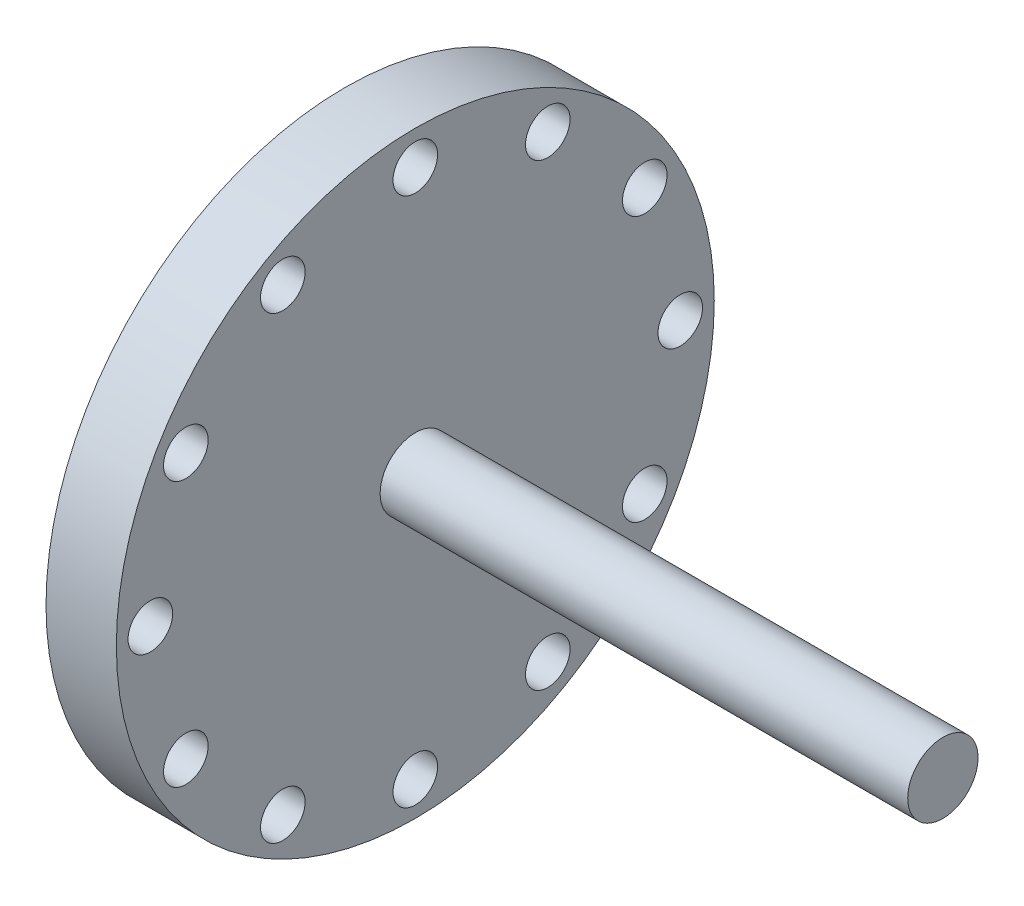
ISO-10303-21;
HEADER;
FILE_DESCRIPTION(('STEP AP214'),'2;1');
FILE_NAME('part.step','',(''),(''),'','','');
FILE_SCHEMA(('AUTOMOTIVE_DESIGN { 1 0 10303 214 1 1 1 1 }'));
ENDSEC;
DATA;
#1=APPLICATION_CONTEXT('core data for automotive mechanical design processes');
#2=APPLICATION_PROTOCOL_DEFINITION('international standard','automotive_design',2000,#1);
#3=PRODUCT_CONTEXT('',#1,'mechanical');
#4=PRODUCT('Part','Part','',(#3));
#5=PRODUCT_RELATED_PRODUCT_CATEGORY('part','',(#4));
#6=PRODUCT_DEFINITION_FORMATION('','',#4);
#7=PRODUCT_DEFINITION_CONTEXT('part definition',#1,'design');
#8=PRODUCT_DEFINITION('design','',#6,#7);
#9=PRODUCT_DEFINITION_SHAPE('','',#8);
#10=(LENGTH_UNIT() NAMED_UNIT(*) SI_UNIT(.MILLI.,.METRE.));
#11=(NAMED_UNIT(*) PLANE_ANGLE_UNIT() SI_UNIT($,.RADIAN.));
#12=(NAMED_UNIT(*) SI_UNIT($,.STERADIAN.) SOLID_ANGLE_UNIT());
#13=UNCERTAINTY_MEASURE_WITH_UNIT(LENGTH_MEASURE(1.E-05),#10,'distance_accuracy_value','');
#14=(GEOMETRIC_REPRESENTATION_CONTEXT(3) GLOBAL_UNCERTAINTY_ASSIGNED_CONTEXT((#13)) GLOBAL_UNIT_ASSIGNED_CONTEXT((#10,
#11,#12)) REPRESENTATION_CONTEXT('',''));
#15=CARTESIAN_POINT('',(0.,0.,0.));
#16=DIRECTION('',(0.,0.,1.));
#17=DIRECTION('',(1.,0.,0.));
#18=AXIS2_PLACEMENT_3D('',#15,#16,#17);
#19=CARTESIAN_POINT('',(0.,0.,0.));
#20=DIRECTION('',(1.,0.,0.));
#21=DIRECTION('',(0.,0.,-1.));
#22=AXIS2_PLACEMENT_3D('',#19,#20,#21);
#23=PLANE('',#22);
#24=CARTESIAN_POINT('',(0.,0.,0.));
#25=DIRECTION('',(-1.,0.,0.));
#26=DIRECTION('',(0.,0.,1.));
#27=AXIS2_PLACEMENT_3D('',#24,#25,#26);
#28=CIRCLE('',#27,20.);
#29=CARTESIAN_POINT('',(0.,0.,20.));
#30=VERTEX_POINT('',#29);
#31=EDGE_CURVE('E10',#30,#30,#28,.T.);
#32=ORIENTED_EDGE('',*,*,#31,.T.);
#33=EDGE_LOOP('',(#32));
#34=FACE_BOUND('',#33,.T.);
#35=ADVANCED_FACE('F37',(#34),#23,.F.);
#36=CARTESIAN_POINT('',(0.,0.,0.));
#37=DIRECTION('',(-1.,0.,0.));
#38=DIRECTION('',(0.,0.,1.));
#39=AXIS2_PLACEMENT_3D('',#36,#37,#38);
#40=CYLINDRICAL_SURFACE('',#39,20.);
#41=ORIENTED_EDGE('',*,*,#31,.F.);
#42=EDGE_LOOP('',(#41));
#43=FACE_BOUND('',#42,.T.);
#44=CARTESIAN_POINT('',(10.,0.,0.));
#45=DIRECTION('',(-1.,0.,0.));
#46=DIRECTION('',(0.,0.,1.));
#47=AXIS2_PLACEMENT_3D('',#44,#45,#46);
#48=CIRCLE('',#47,20.);
#49=CARTESIAN_POINT('',(10.,0.,20.));
#50=VERTEX_POINT('',#49);
#51=EDGE_CURVE('E44',#50,#50,#48,.T.);
#52=ORIENTED_EDGE('',*,*,#51,.T.);
#53=EDGE_LOOP('',(#52));
#54=FACE_BOUND('',#53,.T.);
#55=ADVANCED_FACE('F169',(#43,#54),#40,.T.);
#56=CARTESIAN_POINT('',(10.,20.,0.));
#57=DIRECTION('',(1.,0.,0.));
#58=DIRECTION('',(0.,0.,-1.));
#59=AXIS2_PLACEMENT_3D('',#56,#57,#58);
#60=PLANE('',#59);
#61=CARTESIAN_POINT('',(10.,97.8608706276416,-56.5));
#62=DIRECTION('',(1.,0.,0.));
#63=DIRECTION('',(0.,0.,-1.));
#64=AXIS2_PLACEMENT_3D('',#61,#62,#63);
#65=CIRCLE('',#64,9.50000000000001);
#66=CARTESIAN_POINT('',(10.,97.8608706276416,-66.));
#67=VERTEX_POINT('',#66);
#68=EDGE_CURVE('E95',#67,#67,#65,.F.);
#69=ORIENTED_EDGE('',*,*,#68,.F.);
#70=EDGE_LOOP('',(#69));
#71=FACE_BOUND('',#70,.T.);
#72=CARTESIAN_POINT('',(10.,56.4999999999999,-97.8608706276416));
#73=DIRECTION('',(1.,0.,0.));
#74=DIRECTION('',(0.,0.,-1.));
#75=AXIS2_PLACEMENT_3D('',#72,#73,#74);
#76=CIRCLE('',#75,9.5);
#77=CARTESIAN_POINT('',(10.,56.4999999999999,-107.360870627642));
#78=VERTEX_POINT('',#77);
#79=EDGE_CURVE('E92',#78,#78,#76,.F.);
#80=ORIENTED_EDGE('',*,*,#79,.F.);
#81=EDGE_LOOP('',(#80));
#82=FACE_BOUND('',#81,.T.);
#83=CARTESIAN_POINT('',(10.,0.,-113.));
#84=DIRECTION('',(1.,0.,0.));
#85=DIRECTION('',(0.,0.,-1.));
#86=AXIS2_PLACEMENT_3D('',#83,#84,#85);
#87=CIRCLE('',#86,9.49999999999999);
#88=CARTESIAN_POINT('',(10.,0.,-122.5));
#89=VERTEX_POINT('',#88);
#90=EDGE_CURVE('E89',#89,#89,#87,.F.);
#91=ORIENTED_EDGE('',*,*,#90,.F.);
#92=EDGE_LOOP('',(#91));
#93=FACE_BOUND('',#92,.T.);
#94=CARTESIAN_POINT('',(10.,-56.5,-97.8608706276415));
#95=DIRECTION('',(1.,0.,0.));
#96=DIRECTION('',(0.,0.,-1.));
#97=AXIS2_PLACEMENT_3D('',#94,#95,#96);
#98=CIRCLE('',#97,9.5);
#99=CARTESIAN_POINT('',(10.,-56.5,-107.360870627642));
#100=VERTEX_POINT('',#99);
#101=EDGE_CURVE('E85',#100,#100,#98,.F.);
#102=ORIENTED_EDGE('',*,*,#101,.F.);
#103=EDGE_LOOP('',(#102));
#104=FACE_BOUND('',#103,.T.);
#105=CARTESIAN_POINT('',(10.,-97.8608706276416,-56.5));
#106=DIRECTION('',(1.,0.,0.));
#107=DIRECTION('',(0.,0.,-1.));
#108=AXIS2_PLACEMENT_3D('',#105,#106,#107);
#109=CIRCLE('',#108,9.50000000000001);
#110=CARTESIAN_POINT('',(10.,-97.8608706276416,-66.));
#111=VERTEX_POINT('',#110);
#112=EDGE_CURVE('E81',#111,#111,#109,.F.);
#113=ORIENTED_EDGE('',*,*,#112,.F.);
#114=EDGE_LOOP('',(#113));
#115=FACE_BOUND('',#114,.T.);
#116=CARTESIAN_POINT('',(10.,-113.,0.));
#117=DIRECTION('',(1.,0.,0.));
#118=DIRECTION('',(0.,0.,-1.));
#119=AXIS2_PLACEMENT_3D('',#116,#117,#118);
#120=CIRCLE('',#119,9.49999999999998);
#121=CARTESIAN_POINT('',(10.,-113.,-9.49999999999998));
#122=VERTEX_POINT('',#121);
#123=EDGE_CURVE('E77',#122,#122,#120,.F.);
#124=ORIENTED_EDGE('',*,*,#123,.F.);
#125=EDGE_LOOP('',(#124));
#126=FACE_BOUND('',#125,.T.);
#127=CARTESIAN_POINT('',(10.,-97.8608706276415,56.5));
#128=DIRECTION('',(1.,0.,0.));
#129=DIRECTION('',(0.,0.,-1.));
#130=AXIS2_PLACEMENT_3D('',#127,#128,#129);
#131=CIRCLE('',#130,9.5);
#132=CARTESIAN_POINT('',(10.,-97.8608706276415,47.));
#133=VERTEX_POINT('',#132);
#134=EDGE_CURVE('E73',#133,#133,#131,.F.);
#135=ORIENTED_EDGE('',*,*,#134,.F.);
#136=EDGE_LOOP('',(#135));
#137=FACE_BOUND('',#136,.T.);
#138=CARTESIAN_POINT('',(10.,-56.5,97.8608706276416));
#139=DIRECTION('',(1.,0.,0.));
#140=DIRECTION('',(0.,0.,-1.));
#141=AXIS2_PLACEMENT_3D('',#138,#139,#140);
#142=CIRCLE('',#141,9.5);
#143=CARTESIAN_POINT('',(10.,-56.5,88.3608706276416));
#144=VERTEX_POINT('',#143);
#145=EDGE_CURVE('E69',#144,#144,#142,.F.);
#146=ORIENTED_EDGE('',*,*,#145,.F.);
#147=EDGE_LOOP('',(#146));
#148=FACE_BOUND('',#147,.T.);
#149=CARTESIAN_POINT('',(10.,0.,113.));
#150=DIRECTION('',(1.,0.,0.));
#151=DIRECTION('',(0.,0.,-1.));
#152=AXIS2_PLACEMENT_3D('',#149,#150,#151);
#153=CIRCLE('',#152,9.49999999999999);
#154=CARTESIAN_POINT('',(10.,0.,103.5));
#155=VERTEX_POINT('',#154);
#156=EDGE_CURVE('E65',#155,#155,#153,.F.);
#157=ORIENTED_EDGE('',*,*,#156,.F.);
#158=EDGE_LOOP('',(#157));
#159=FACE_BOUND('',#158,.T.);
#160=CARTESIAN_POINT('',(10.,56.5,97.8608706276416));
#161=DIRECTION('',(1.,0.,0.));
#162=DIRECTION('',(0.,0.,-1.));
#163=AXIS2_PLACEMENT_3D('',#160,#161,#162);
#164=CIRCLE('',#163,9.5);
#165=CARTESIAN_POINT('',(10.,56.5,88.3608706276416));
#166=VERTEX_POINT('',#165);
#167=EDGE_CURVE('E61',#166,#166,#164,.F.);
#168=ORIENTED_EDGE('',*,*,#167,.F.);
#169=EDGE_LOOP('',(#168));
#170=FACE_BOUND('',#169,.T.);
#171=CARTESIAN_POINT('',(10.,97.8608706276416,56.5));
#172=DIRECTION('',(1.,0.,0.));
#173=DIRECTION('',(0.,0.,-1.));
#174=AXIS2_PLACEMENT_3D('',#171,#172,#173);
#175=CIRCLE('',#174,9.5);
#176=CARTESIAN_POINT('',(10.,97.8608706276416,47.));
#177=VERTEX_POINT('',#176);
#178=EDGE_CURVE('E57',#177,#177,#175,.F.);
#179=ORIENTED_EDGE('',*,*,#178,.F.);
#180=EDGE_LOOP('',(#179));
#181=FACE_BOUND('',#180,.T.);
#182=CARTESIAN_POINT('',(10.,113.,0.));
#183=DIRECTION('',(1.,0.,0.));
#184=DIRECTION('',(0.,0.,-1.));
#185=AXIS2_PLACEMENT_3D('',#182,#183,#184);
#186=CIRCLE('',#185,9.50000000000001);
#187=CARTESIAN_POINT('',(10.,113.,-9.50000000000001));
#188=VERTEX_POINT('',#187);
#189=EDGE_CURVE('E56',#188,#188,#186,.F.);
#190=ORIENTED_EDGE('',*,*,#189,.F.);
#191=EDGE_LOOP('',(#190));
#192=FACE_BOUND('',#191,.T.);
#193=ORIENTED_EDGE('',*,*,#51,.F.);
#194=EDGE_LOOP('',(#193));
#195=FACE_BOUND('',#194,.T.);
#196=CARTESIAN_POINT('',(10.,0.,0.));
#197=DIRECTION('',(-1.,0.,0.));
#198=DIRECTION('',(0.,0.,1.));
#199=AXIS2_PLACEMENT_3D('',#196,#197,#198);
#200=CIRCLE('',#199,127.5);
#201=CARTESIAN_POINT('',(10.,0.,127.5));
#202=VERTEX_POINT('',#201);
#203=EDGE_CURVE('E49',#202,#202,#200,.T.);
#204=ORIENTED_EDGE('',*,*,#203,.T.);
#205=EDGE_LOOP('',(#204));
#206=FACE_BOUND('',#205,.T.);
#207=ADVANCED_FACE('F137',(#71,#82,#93,#104,#115,#126,#137,#148,#159,#170,#181,#192,#195,#206),
#60,.F.);
#208=CARTESIAN_POINT('',(0.,0.,0.));
#209=DIRECTION('',(-1.,0.,0.));
#210=DIRECTION('',(0.,0.,1.));
#211=AXIS2_PLACEMENT_3D('',#208,#209,#210);
#212=CYLINDRICAL_SURFACE('',#211,127.5);
#213=ORIENTED_EDGE('',*,*,#203,.F.);
#214=EDGE_LOOP('',(#213));
#215=FACE_BOUND('',#214,.T.);
#216=CARTESIAN_POINT('',(40.,0.,0.));
#217=DIRECTION('',(-1.,0.,0.));
#218=DIRECTION('',(0.,0.,1.));
#219=AXIS2_PLACEMENT_3D('',#216,#217,#218);
#220=CIRCLE('',#219,127.5);
#221=CARTESIAN_POINT('',(40.,0.,127.5));
#222=VERTEX_POINT('',#221);
#223=EDGE_CURVE('E132',#222,#222,#220,.T.);
#224=ORIENTED_EDGE('',*,*,#223,.T.);
#225=EDGE_LOOP('',(#224));
#226=FACE_BOUND('',#225,.T.);
#227=ADVANCED_FACE('F139',(#215,#226),#212,.T.);
#228=CARTESIAN_POINT('',(40.,127.5,0.));
#229=DIRECTION('',(-1.,0.,0.));
#230=DIRECTION('',(0.,0.,1.));
#231=AXIS2_PLACEMENT_3D('',#228,#229,#230);
#232=PLANE('',#231);
#233=CARTESIAN_POINT('',(40.,97.8608706276416,-56.5));
#234=DIRECTION('',(-1.,0.,0.));
#235=DIRECTION('',(0.,0.,1.));
#236=AXIS2_PLACEMENT_3D('',#233,#234,#235);
#237=CIRCLE('',#236,9.50000000000001);
#238=CARTESIAN_POINT('',(40.,97.8608706276416,-47.));
#239=VERTEX_POINT('',#238);
#240=EDGE_CURVE('E40',#239,#239,#237,.F.);
#241=ORIENTED_EDGE('',*,*,#240,.F.);
#242=EDGE_LOOP('',(#241));
#243=FACE_BOUND('',#242,.T.);
#244=CARTESIAN_POINT('',(40.,56.4999999999999,-97.8608706276416));
#245=DIRECTION('',(-1.,0.,0.));
#246=DIRECTION('',(0.,0.,1.));
#247=AXIS2_PLACEMENT_3D('',#244,#245,#246);
#248=CIRCLE('',#247,9.5);
#249=CARTESIAN_POINT('',(40.,56.4999999999999,-88.3608706276416));
#250=VERTEX_POINT('',#249);
#251=EDGE_CURVE('E93',#250,#250,#248,.F.);
#252=ORIENTED_EDGE('',*,*,#251,.F.);
#253=EDGE_LOOP('',(#252));
#254=FACE_BOUND('',#253,.T.);
#255=CARTESIAN_POINT('',(40.,0.,-113.));
#256=DIRECTION('',(-1.,0.,0.));
#257=DIRECTION('',(0.,0.,1.));
#258=AXIS2_PLACEMENT_3D('',#255,#256,#257);
#259=CIRCLE('',#258,9.49999999999999);
#260=CARTESIAN_POINT('',(40.,0.,-103.5));
#261=VERTEX_POINT('',#260);
#262=EDGE_CURVE('E90',#261,#261,#259,.F.);
#263=ORIENTED_EDGE('',*,*,#262,.F.);
#264=EDGE_LOOP('',(#263));
#265=FACE_BOUND('',#264,.T.);
#266=CARTESIAN_POINT('',(40.,-56.5,-97.8608706276415));
#267=DIRECTION('',(-1.,0.,0.));
#268=DIRECTION('',(0.,0.,1.));
#269=AXIS2_PLACEMENT_3D('',#266,#267,#268);
#270=CIRCLE('',#269,9.5);
#271=CARTESIAN_POINT('',(40.,-56.5,-88.3608706276415));
#272=VERTEX_POINT('',#271);
#273=EDGE_CURVE('E86',#272,#272,#270,.F.);
#274=ORIENTED_EDGE('',*,*,#273,.F.);
#275=EDGE_LOOP('',(#274));
#276=FACE_BOUND('',#275,.T.);
#277=CARTESIAN_POINT('',(40.,-97.8608706276416,-56.5));
#278=DIRECTION('',(-1.,0.,0.));
#279=DIRECTION('',(0.,0.,1.));
#280=AXIS2_PLACEMENT_3D('',#277,#278,#279);
#281=CIRCLE('',#280,9.50000000000001);
#282=CARTESIAN_POINT('',(40.,-97.8608706276416,-47.));
#283=VERTEX_POINT('',#282);
#284=EDGE_CURVE('E82',#283,#283,#281,.F.);
#285=ORIENTED_EDGE('',*,*,#284,.F.);
#286=EDGE_LOOP('',(#285));
#287=FACE_BOUND('',#286,.T.);
#288=CARTESIAN_POINT('',(40.,-113.,0.));
#289=DIRECTION('',(-1.,0.,0.));
#290=DIRECTION('',(0.,0.,1.));
#291=AXIS2_PLACEMENT_3D('',#288,#289,#290);
#292=CIRCLE('',#291,9.49999999999998);
#293=CARTESIAN_POINT('',(40.,-113.,9.49999999999998));
#294=VERTEX_POINT('',#293);
#295=EDGE_CURVE('E78',#294,#294,#292,.F.);
#296=ORIENTED_EDGE('',*,*,#295,.F.);
#297=EDGE_LOOP('',(#296));
#298=FACE_BOUND('',#297,.T.);
#299=CARTESIAN_POINT('',(40.,-97.8608706276415,56.5));
#300=DIRECTION('',(-1.,0.,0.));
#301=DIRECTION('',(0.,0.,1.));
#302=AXIS2_PLACEMENT_3D('',#299,#300,#301);
#303=CIRCLE('',#302,9.5);
#304=CARTESIAN_POINT('',(40.,-97.8608706276415,66.));
#305=VERTEX_POINT('',#304);
#306=EDGE_CURVE('E74',#305,#305,#303,.F.);
#307=ORIENTED_EDGE('',*,*,#306,.F.);
#308=EDGE_LOOP('',(#307));
#309=FACE_BOUND('',#308,.T.);
#310=CARTESIAN_POINT('',(40.,-56.5,97.8608706276416));
#311=DIRECTION('',(-1.,0.,0.));
#312=DIRECTION('',(0.,0.,1.));
#313=AXIS2_PLACEMENT_3D('',#310,#311,#312);
#314=CIRCLE('',#313,9.5);
#315=CARTESIAN_POINT('',(40.,-56.5,107.360870627642));
#316=VERTEX_POINT('',#315);
#317=EDGE_CURVE('E70',#316,#316,#314,.F.);
#318=ORIENTED_EDGE('',*,*,#317,.F.);
#319=EDGE_LOOP('',(#318));
#320=FACE_BOUND('',#319,.T.);
#321=CARTESIAN_POINT('',(40.,0.,113.));
#322=DIRECTION('',(-1.,0.,0.));
#323=DIRECTION('',(0.,0.,1.));
#324=AXIS2_PLACEMENT_3D('',#321,#322,#323);
#325=CIRCLE('',#324,9.49999999999999);
#326=CARTESIAN_POINT('',(40.,0.,122.5));
#327=VERTEX_POINT('',#326);
#328=EDGE_CURVE('E66',#327,#327,#325,.F.);
#329=ORIENTED_EDGE('',*,*,#328,.F.);
#330=EDGE_LOOP('',(#329));
#331=FACE_BOUND('',#330,.T.);
#332=CARTESIAN_POINT('',(40.,56.5,97.8608706276416));
#333=DIRECTION('',(-1.,0.,0.));
#334=DIRECTION('',(0.,0.,1.));
#335=AXIS2_PLACEMENT_3D('',#332,#333,#334);
#336=CIRCLE('',#335,9.5);
#337=CARTESIAN_POINT('',(40.,56.5,107.360870627642));
#338=VERTEX_POINT('',#337);
#339=EDGE_CURVE('E62',#338,#338,#336,.F.);
#340=ORIENTED_EDGE('',*,*,#339,.F.);
#341=EDGE_LOOP('',(#340));
#342=FACE_BOUND('',#341,.T.);
#343=CARTESIAN_POINT('',(40.,97.8608706276416,56.5));
#344=DIRECTION('',(-1.,0.,0.));
#345=DIRECTION('',(0.,0.,1.));
#346=AXIS2_PLACEMENT_3D('',#343,#344,#345);
#347=CIRCLE('',#346,9.5);
#348=CARTESIAN_POINT('',(40.,97.8608706276416,66.));
#349=VERTEX_POINT('',#348);
#350=EDGE_CURVE('E58',#349,#349,#347,.F.);
#351=ORIENTED_EDGE('',*,*,#350,.F.);
#352=EDGE_LOOP('',(#351));
#353=FACE_BOUND('',#352,.T.);
#354=CARTESIAN_POINT('',(40.,113.,0.));
#355=DIRECTION('',(-1.,0.,0.));
#356=DIRECTION('',(0.,0.,1.));
#357=AXIS2_PLACEMENT_3D('',#354,#355,#356);
#358=CIRCLE('',#357,9.50000000000001);
#359=CARTESIAN_POINT('',(40.,113.,9.50000000000001));
#360=VERTEX_POINT('',#359);
#361=EDGE_CURVE('E53',#360,#360,#358,.F.);
#362=ORIENTED_EDGE('',*,*,#361,.F.);
#363=EDGE_LOOP('',(#362));
#364=FACE_BOUND('',#363,.T.);
#365=ORIENTED_EDGE('',*,*,#223,.F.);
#366=EDGE_LOOP('',(#365));
#367=FACE_BOUND('',#366,.T.);
#368=CARTESIAN_POINT('',(40.,0.,0.));
#369=DIRECTION('',(-1.,0.,0.));
#370=DIRECTION('',(0.,0.,1.));
#371=AXIS2_PLACEMENT_3D('',#368,#369,#370);
#372=CIRCLE('',#371,15.);
#373=CARTESIAN_POINT('',(40.,0.,15.));
#374=VERTEX_POINT('',#373);
#375=EDGE_CURVE('E129',#374,#374,#372,.T.);
#376=ORIENTED_EDGE('',*,*,#375,.T.);
#377=EDGE_LOOP('',(#376));
#378=FACE_BOUND('',#377,.T.);
#379=ADVANCED_FACE('F142',(#243,#254,#265,#276,#287,#298,#309,#320,#331,#342,#353,#364,#367,
#378),#232,.F.);
#380=CARTESIAN_POINT('',(0.,0.,0.));
#381=DIRECTION('',(-1.,0.,0.));
#382=DIRECTION('',(0.,0.,1.));
#383=AXIS2_PLACEMENT_3D('',#380,#381,#382);
#384=CYLINDRICAL_SURFACE('',#383,15.);
#385=ORIENTED_EDGE('',*,*,#375,.F.);
#386=EDGE_LOOP('',(#385));
#387=FACE_BOUND('',#386,.T.);
#388=CARTESIAN_POINT('',(265.,0.,0.));
#389=DIRECTION('',(-1.,0.,0.));
#390=DIRECTION('',(0.,0.,1.));
#391=AXIS2_PLACEMENT_3D('',#388,#389,#390);
#392=CIRCLE('',#391,15.);
#393=CARTESIAN_POINT('',(265.,0.,15.));
#394=VERTEX_POINT('',#393);
#395=EDGE_CURVE('E126',#394,#394,#392,.T.);
#396=ORIENTED_EDGE('',*,*,#395,.T.);
#397=EDGE_LOOP('',(#396));
#398=FACE_BOUND('',#397,.T.);
#399=ADVANCED_FACE('F148',(#387,#398),#384,.T.);
#400=CARTESIAN_POINT('',(265.,15.,0.));
#401=DIRECTION('',(-1.,0.,0.));
#402=DIRECTION('',(0.,0.,1.));
#403=AXIS2_PLACEMENT_3D('',#400,#401,#402);
#404=PLANE('',#403);
#405=ORIENTED_EDGE('',*,*,#395,.F.);
#406=EDGE_LOOP('',(#405));
#407=FACE_BOUND('',#406,.T.);
#408=ADVANCED_FACE('F155',(#407),#404,.F.);
#409=CARTESIAN_POINT('',(265.,113.,0.));
#410=DIRECTION('',(-1.,0.,0.));
#411=DIRECTION('',(0.,0.,1.));
#412=AXIS2_PLACEMENT_3D('',#409,#410,#411);
#413=CYLINDRICAL_SURFACE('',#412,9.50000000000001);
#414=ORIENTED_EDGE('',*,*,#361,.T.);
#415=EDGE_LOOP('',(#414));
#416=FACE_BOUND('',#415,.T.);
#417=ORIENTED_EDGE('',*,*,#189,.T.);
#418=EDGE_LOOP('',(#417));
#419=FACE_BOUND('',#418,.T.);
#420=ADVANCED_FACE('F160',(#416,#419),#413,.F.);
#421=CARTESIAN_POINT('',(265.,97.8608706276416,56.5));
#422=DIRECTION('',(-1.,0.,0.));
#423=DIRECTION('',(0.,0.,1.));
#424=AXIS2_PLACEMENT_3D('',#421,#422,#423);
#425=CYLINDRICAL_SURFACE('',#424,9.5);
#426=ORIENTED_EDGE('',*,*,#350,.T.);
#427=EDGE_LOOP('',(#426));
#428=FACE_BOUND('',#427,.T.);
#429=ORIENTED_EDGE('',*,*,#178,.T.);
#430=EDGE_LOOP('',(#429));
#431=FACE_BOUND('',#430,.T.);
#432=ADVANCED_FACE('F165',(#428,#431),#425,.F.);
#433=CARTESIAN_POINT('',(265.,56.5,97.8608706276416));
#434=DIRECTION('',(-1.,0.,0.));
#435=DIRECTION('',(0.,0.,1.));
#436=AXIS2_PLACEMENT_3D('',#433,#434,#435);
#437=CYLINDRICAL_SURFACE('',#436,9.5);
#438=ORIENTED_EDGE('',*,*,#339,.T.);
#439=EDGE_LOOP('',(#438));
#440=FACE_BOUND('',#439,.T.);
#441=ORIENTED_EDGE('',*,*,#167,.T.);
#442=EDGE_LOOP('',(#441));
#443=FACE_BOUND('',#442,.T.);
#444=ADVANCED_FACE('F210',(#440,#443),#437,.F.);
#445=CARTESIAN_POINT('',(265.,0.,113.));
#446=DIRECTION('',(-1.,0.,0.));
#447=DIRECTION('',(0.,0.,1.));
#448=AXIS2_PLACEMENT_3D('',#445,#446,#447);
#449=CYLINDRICAL_SURFACE('',#448,9.49999999999999);
#450=ORIENTED_EDGE('',*,*,#328,.T.);
#451=EDGE_LOOP('',(#450));
#452=FACE_BOUND('',#451,.T.);
#453=ORIENTED_EDGE('',*,*,#156,.T.);
#454=EDGE_LOOP('',(#453));
#455=FACE_BOUND('',#454,.T.);
#456=ADVANCED_FACE('F216',(#452,#455),#449,.F.);
#457=CARTESIAN_POINT('',(265.,-56.5,97.8608706276416));
#458=DIRECTION('',(-1.,0.,0.));
#459=DIRECTION('',(0.,0.,1.));
#460=AXIS2_PLACEMENT_3D('',#457,#458,#459);
#461=CYLINDRICAL_SURFACE('',#460,9.5);
#462=ORIENTED_EDGE('',*,*,#317,.T.);
#463=EDGE_LOOP('',(#462));
#464=FACE_BOUND('',#463,.T.);
#465=ORIENTED_EDGE('',*,*,#145,.T.);
#466=EDGE_LOOP('',(#465));
#467=FACE_BOUND('',#466,.T.);
#468=ADVANCED_FACE('F222',(#464,#467),#461,.F.);
#469=CARTESIAN_POINT('',(265.,-97.8608706276415,56.5));
#470=DIRECTION('',(-1.,0.,0.));
#471=DIRECTION('',(0.,0.,1.));
#472=AXIS2_PLACEMENT_3D('',#469,#470,#471);
#473=CYLINDRICAL_SURFACE('',#472,9.5);
#474=ORIENTED_EDGE('',*,*,#306,.T.);
#475=EDGE_LOOP('',(#474));
#476=FACE_BOUND('',#475,.T.);
#477=ORIENTED_EDGE('',*,*,#134,.T.);
#478=EDGE_LOOP('',(#477));
#479=FACE_BOUND('',#478,.T.);
#480=ADVANCED_FACE('F226',(#476,#479),#473,.F.);
#481=CARTESIAN_POINT('',(265.,-113.,0.));
#482=DIRECTION('',(-1.,0.,0.));
#483=DIRECTION('',(0.,0.,1.));
#484=AXIS2_PLACEMENT_3D('',#481,#482,#483);
#485=CYLINDRICAL_SURFACE('',#484,9.49999999999998);
#486=ORIENTED_EDGE('',*,*,#295,.T.);
#487=EDGE_LOOP('',(#486));
#488=FACE_BOUND('',#487,.T.);
#489=ORIENTED_EDGE('',*,*,#123,.T.);
#490=EDGE_LOOP('',(#489));
#491=FACE_BOUND('',#490,.T.);
#492=ADVANCED_FACE('F230',(#488,#491),#485,.F.);
#493=CARTESIAN_POINT('',(265.,-97.8608706276416,-56.5));
#494=DIRECTION('',(-1.,0.,0.));
#495=DIRECTION('',(0.,0.,1.));
#496=AXIS2_PLACEMENT_3D('',#493,#494,#495);
#497=CYLINDRICAL_SURFACE('',#496,9.50000000000001);
#498=ORIENTED_EDGE('',*,*,#284,.T.);
#499=EDGE_LOOP('',(#498));
#500=FACE_BOUND('',#499,.T.);
#501=ORIENTED_EDGE('',*,*,#112,.T.);
#502=EDGE_LOOP('',(#501));
#503=FACE_BOUND('',#502,.T.);
#504=ADVANCED_FACE('F234',(#500,#503),#497,.F.);
#505=CARTESIAN_POINT('',(265.,-56.5,-97.8608706276415));
#506=DIRECTION('',(-1.,0.,0.));
#507=DIRECTION('',(0.,0.,1.));
#508=AXIS2_PLACEMENT_3D('',#505,#506,#507);
#509=CYLINDRICAL_SURFACE('',#508,9.5);
#510=ORIENTED_EDGE('',*,*,#273,.T.);
#511=EDGE_LOOP('',(#510));
#512=FACE_BOUND('',#511,.T.);
#513=ORIENTED_EDGE('',*,*,#101,.T.);
#514=EDGE_LOOP('',(#513));
#515=FACE_BOUND('',#514,.T.);
#516=ADVANCED_FACE('F238',(#512,#515),#509,.F.);
#517=CARTESIAN_POINT('',(265.,0.,-113.));
#518=DIRECTION('',(-1.,0.,0.));
#519=DIRECTION('',(0.,0.,1.));
#520=AXIS2_PLACEMENT_3D('',#517,#518,#519);
#521=CYLINDRICAL_SURFACE('',#520,9.49999999999999);
#522=ORIENTED_EDGE('',*,*,#262,.T.);
#523=EDGE_LOOP('',(#522));
#524=FACE_BOUND('',#523,.T.);
#525=ORIENTED_EDGE('',*,*,#90,.T.);
#526=EDGE_LOOP('',(#525));
#527=FACE_BOUND('',#526,.T.);
#528=ADVANCED_FACE('F242',(#524,#527),#521,.F.);
#529=CARTESIAN_POINT('',(265.,56.4999999999999,-97.8608706276416));
#530=DIRECTION('',(-1.,0.,0.));
#531=DIRECTION('',(0.,0.,1.));
#532=AXIS2_PLACEMENT_3D('',#529,#530,#531);
#533=CYLINDRICAL_SURFACE('',#532,9.5);
#534=ORIENTED_EDGE('',*,*,#251,.T.);
#535=EDGE_LOOP('',(#534));
#536=FACE_BOUND('',#535,.T.);
#537=ORIENTED_EDGE('',*,*,#79,.T.);
#538=EDGE_LOOP('',(#537));
#539=FACE_BOUND('',#538,.T.);
#540=ADVANCED_FACE('F246',(#536,#539),#533,.F.);
#541=CARTESIAN_POINT('',(265.,97.8608706276416,-56.5));
#542=DIRECTION('',(-1.,0.,0.));
#543=DIRECTION('',(0.,0.,1.));
#544=AXIS2_PLACEMENT_3D('',#541,#542,#543);
#545=CYLINDRICAL_SURFACE('',#544,9.50000000000001);
#546=ORIENTED_EDGE('',*,*,#240,.T.);
#547=EDGE_LOOP('',(#546));
#548=FACE_BOUND('',#547,.T.);
#549=ORIENTED_EDGE('',*,*,#68,.T.);
#550=EDGE_LOOP('',(#549));
#551=FACE_BOUND('',#550,.T.);
#552=ADVANCED_FACE('F249',(#548,#551),#545,.F.);
#553=CLOSED_SHELL('',(#35,#55,#207,#227,#379,#399,#408,#420,#432,#444,#456,#468,#480,#492,#504,
#516,#528,#540,#552));
#554=MANIFOLD_SOLID_BREP('B2',#553);
#555=ADVANCED_BREP_SHAPE_REPRESENTATION('',(#18,#554),#14);
#556=SHAPE_DEFINITION_REPRESENTATION(#9,#555);
ENDSEC;
END-ISO-10303-21;
